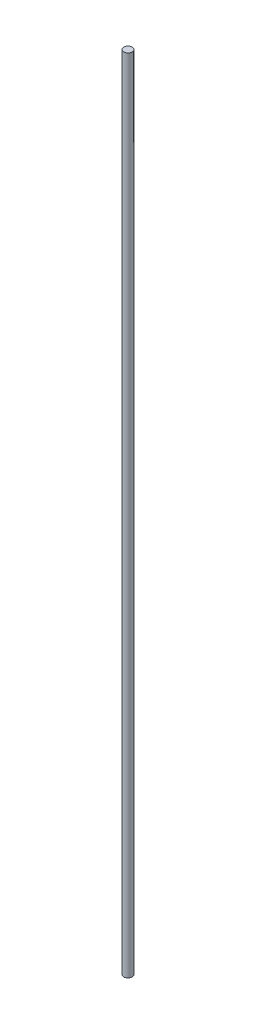
ISO-10303-21;
HEADER;
FILE_DESCRIPTION(('STEP AP214'),'2;1');
FILE_NAME('part.step','',(''),(''),'','','');
FILE_SCHEMA(('AUTOMOTIVE_DESIGN { 1 0 10303 214 1 1 1 1 }'));
ENDSEC;
DATA;
#1=APPLICATION_CONTEXT('core data for automotive mechanical design processes');
#2=APPLICATION_PROTOCOL_DEFINITION('international standard','automotive_design',2000,#1);
#3=PRODUCT_CONTEXT('',#1,'mechanical');
#4=PRODUCT('Part','Part','',(#3));
#5=PRODUCT_RELATED_PRODUCT_CATEGORY('part','',(#4));
#6=PRODUCT_DEFINITION_FORMATION('','',#4);
#7=PRODUCT_DEFINITION_CONTEXT('part definition',#1,'design');
#8=PRODUCT_DEFINITION('design','',#6,#7);
#9=PRODUCT_DEFINITION_SHAPE('','',#8);
#10=(LENGTH_UNIT() NAMED_UNIT(*) SI_UNIT(.MILLI.,.METRE.));
#11=(NAMED_UNIT(*) PLANE_ANGLE_UNIT() SI_UNIT($,.RADIAN.));
#12=(NAMED_UNIT(*) SI_UNIT($,.STERADIAN.) SOLID_ANGLE_UNIT());
#13=UNCERTAINTY_MEASURE_WITH_UNIT(LENGTH_MEASURE(1.E-05),#10,'distance_accuracy_value','');
#14=(GEOMETRIC_REPRESENTATION_CONTEXT(3) GLOBAL_UNCERTAINTY_ASSIGNED_CONTEXT((#13)) GLOBAL_UNIT_ASSIGNED_CONTEXT((#10,
#11,#12)) REPRESENTATION_CONTEXT('',''));
#15=CARTESIAN_POINT('',(0.,0.,0.));
#16=DIRECTION('',(0.,0.,1.));
#17=DIRECTION('',(1.,0.,0.));
#18=AXIS2_PLACEMENT_3D('',#15,#16,#17);
#19=CARTESIAN_POINT('',(0.,593.725,0.));
#20=DIRECTION('',(0.,-1.,0.));
#21=DIRECTION('',(0.,0.,-1.));
#22=AXIS2_PLACEMENT_3D('',#19,#20,#21);
#23=CYLINDRICAL_SURFACE('',#22,3.175);
#24=CARTESIAN_POINT('',(0.,593.725,0.));
#25=DIRECTION('',(0.,1.,0.));
#26=DIRECTION('',(0.,0.,1.));
#27=AXIS2_PLACEMENT_3D('',#24,#25,#26);
#28=CIRCLE('',#27,3.175);
#29=CARTESIAN_POINT('',(0.,593.725,3.175));
#30=VERTEX_POINT('',#29);
#31=EDGE_CURVE('E10',#30,#30,#28,.T.);
#32=ORIENTED_EDGE('',*,*,#31,.F.);
#33=EDGE_LOOP('',(#32));
#34=FACE_BOUND('',#33,.T.);
#35=CARTESIAN_POINT('',(0.,0.,0.));
#36=DIRECTION('',(0.,1.,0.));
#37=DIRECTION('',(0.,0.,1.));
#38=AXIS2_PLACEMENT_3D('',#35,#36,#37);
#39=CIRCLE('',#38,3.175);
#40=CARTESIAN_POINT('',(0.,0.,3.175));
#41=VERTEX_POINT('',#40);
#42=EDGE_CURVE('E34',#41,#41,#39,.T.);
#43=ORIENTED_EDGE('',*,*,#42,.T.);
#44=EDGE_LOOP('',(#43));
#45=FACE_BOUND('',#44,.T.);
#46=ADVANCED_FACE('F31',(#34,#45),#23,.T.);
#47=CARTESIAN_POINT('',(0.,593.725,0.));
#48=DIRECTION('',(0.,1.,0.));
#49=DIRECTION('',(0.,0.,1.));
#50=AXIS2_PLACEMENT_3D('',#47,#48,#49);
#51=PLANE('',#50);
#52=ORIENTED_EDGE('',*,*,#31,.T.);
#53=EDGE_LOOP('',(#52));
#54=FACE_BOUND('',#53,.T.);
#55=ADVANCED_FACE('F46',(#54),#51,.T.);
#56=CARTESIAN_POINT('',(0.,0.,0.));
#57=DIRECTION('',(0.,1.,0.));
#58=DIRECTION('',(0.,0.,1.));
#59=AXIS2_PLACEMENT_3D('',#56,#57,#58);
#60=PLANE('',#59);
#61=ORIENTED_EDGE('',*,*,#42,.F.);
#62=EDGE_LOOP('',(#61));
#63=FACE_BOUND('',#62,.T.);
#64=ADVANCED_FACE('F44',(#63),#60,.F.);
#65=CLOSED_SHELL('',(#46,#55,#64));
#66=MANIFOLD_SOLID_BREP('B2',#65);
#67=ADVANCED_BREP_SHAPE_REPRESENTATION('',(#18,#66),#14);
#68=SHAPE_DEFINITION_REPRESENTATION(#9,#67);
ENDSEC;
END-ISO-10303-21;
